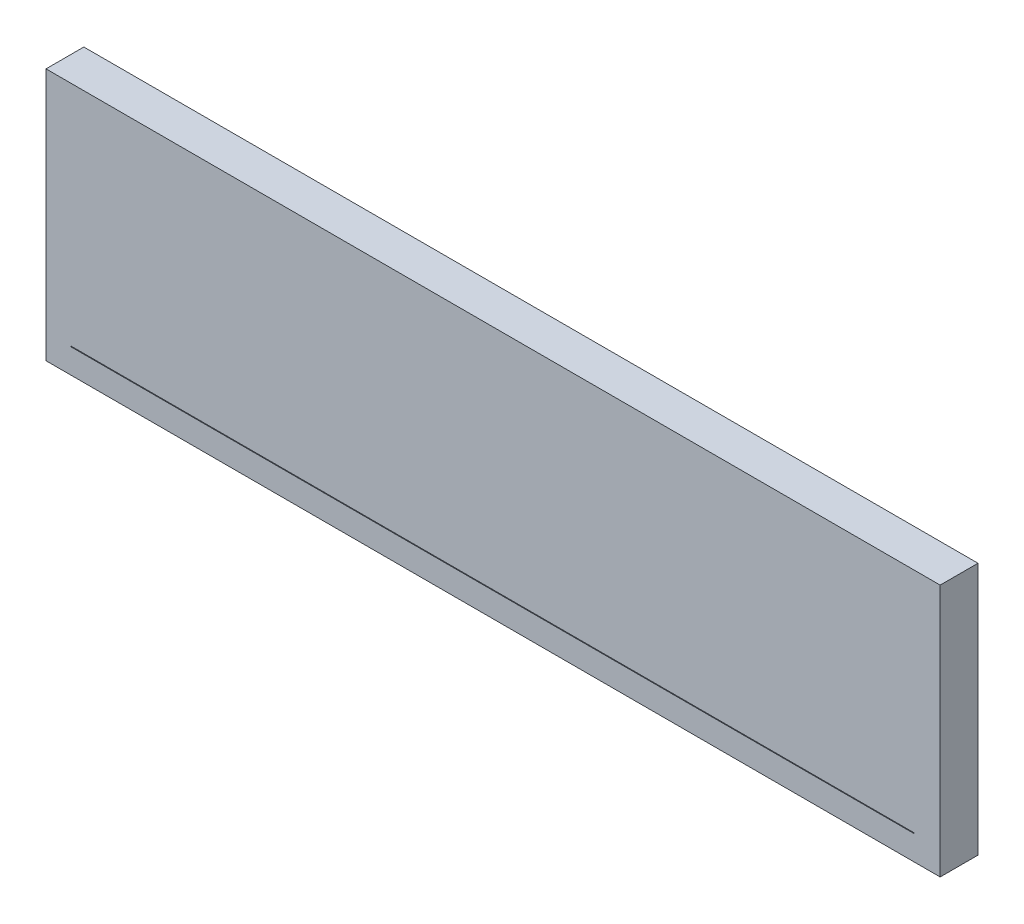
ISO-10303-21;
HEADER;
FILE_DESCRIPTION(('STEP AP214'),'2;1');
FILE_NAME('part.step','',(''),(''),'','','');
FILE_SCHEMA(('AUTOMOTIVE_DESIGN { 1 0 10303 214 1 1 1 1 }'));
ENDSEC;
DATA;
#1=APPLICATION_CONTEXT('core data for automotive mechanical design processes');
#2=APPLICATION_PROTOCOL_DEFINITION('international standard','automotive_design',2000,#1);
#3=PRODUCT_CONTEXT('',#1,'mechanical');
#4=PRODUCT('Part','Part','',(#3));
#5=PRODUCT_RELATED_PRODUCT_CATEGORY('part','',(#4));
#6=PRODUCT_DEFINITION_FORMATION('','',#4);
#7=PRODUCT_DEFINITION_CONTEXT('part definition',#1,'design');
#8=PRODUCT_DEFINITION('design','',#6,#7);
#9=PRODUCT_DEFINITION_SHAPE('','',#8);
#10=(LENGTH_UNIT() NAMED_UNIT(*) SI_UNIT(.MILLI.,.METRE.));
#11=(NAMED_UNIT(*) PLANE_ANGLE_UNIT() SI_UNIT($,.RADIAN.));
#12=(NAMED_UNIT(*) SI_UNIT($,.STERADIAN.) SOLID_ANGLE_UNIT());
#13=UNCERTAINTY_MEASURE_WITH_UNIT(LENGTH_MEASURE(1.E-05),#10,'distance_accuracy_value','');
#14=(GEOMETRIC_REPRESENTATION_CONTEXT(3) GLOBAL_UNCERTAINTY_ASSIGNED_CONTEXT((#13)) GLOBAL_UNIT_ASSIGNED_CONTEXT((#10,
#11,#12)) REPRESENTATION_CONTEXT('',''));
#15=CARTESIAN_POINT('',(0.,0.,0.));
#16=DIRECTION('',(0.,0.,1.));
#17=DIRECTION('',(1.,0.,0.));
#18=AXIS2_PLACEMENT_3D('',#15,#16,#17);
#19=CARTESIAN_POINT('',(-16.7,-4.01,1.));
#20=DIRECTION('',(0.,1.,0.));
#21=DIRECTION('',(0.,0.,1.));
#22=AXIS2_PLACEMENT_3D('',#19,#20,#21);
#23=PLANE('',#22);
#24=DIRECTION('',(1.,0.,0.));
#25=VECTOR('',#24,1.);
#26=CARTESIAN_POINT('',(-16.7,-4.01,0.));
#27=LINE('',#26,#25);
#28=CARTESIAN_POINT('',(-16.7,-4.01,0.));
#29=VERTEX_POINT('',#28);
#30=CARTESIAN_POINT('',(16.7,-4.01,0.));
#31=VERTEX_POINT('',#30);
#32=EDGE_CURVE('E64',#29,#31,#27,.T.);
#33=ORIENTED_EDGE('',*,*,#32,.T.);
#34=DIRECTION('',(0.,0.,-1.));
#35=VECTOR('',#34,1.);
#36=CARTESIAN_POINT('',(16.7,-4.01,1.));
#37=LINE('',#36,#35);
#38=CARTESIAN_POINT('',(16.7,-4.01,1.));
#39=VERTEX_POINT('',#38);
#40=EDGE_CURVE('E43',#39,#31,#37,.T.);
#41=ORIENTED_EDGE('',*,*,#40,.F.);
#42=DIRECTION('',(1.,0.,0.));
#43=VECTOR('',#42,1.);
#44=CARTESIAN_POINT('',(-16.7,-4.01,1.));
#45=LINE('',#44,#43);
#46=CARTESIAN_POINT('',(-16.7,-4.01,1.));
#47=VERTEX_POINT('',#46);
#48=EDGE_CURVE('E51',#47,#39,#45,.T.);
#49=ORIENTED_EDGE('',*,*,#48,.F.);
#50=DIRECTION('',(0.,0.,-1.));
#51=VECTOR('',#50,1.);
#52=CARTESIAN_POINT('',(-16.7,-4.01,1.));
#53=LINE('',#52,#51);
#54=EDGE_CURVE('E11',#47,#29,#53,.T.);
#55=ORIENTED_EDGE('',*,*,#54,.T.);
#56=EDGE_LOOP('',(#33,#41,#49,#55));
#57=FACE_BOUND('',#56,.T.);
#58=ADVANCED_FACE('F35',(#57),#23,.F.);
#59=CARTESIAN_POINT('',(0.,0.,1.));
#60=DIRECTION('',(0.,0.,-1.));
#61=DIRECTION('',(-1.,0.,0.));
#62=AXIS2_PLACEMENT_3D('',#59,#60,#61);
#63=PLANE('',#62);
#64=DIRECTION('',(0.,-1.,0.));
#65=VECTOR('',#64,1.);
#66=CARTESIAN_POINT('',(-16.7,-4.03759629206268,1.));
#67=LINE('',#66,#65);
#68=CARTESIAN_POINT('',(-16.7,-4.03759629206268,1.));
#69=VERTEX_POINT('',#68);
#70=EDGE_CURVE('E141',#47,#69,#67,.T.);
#71=ORIENTED_EDGE('',*,*,#70,.F.);
#72=ORIENTED_EDGE('',*,*,#48,.T.);
#73=DIRECTION('',(0.,1.,0.));
#74=VECTOR('',#73,1.);
#75=CARTESIAN_POINT('',(16.7,4.01,1.));
#76=LINE('',#75,#74);
#77=CARTESIAN_POINT('',(16.7,-4.03759629206268,1.));
#78=VERTEX_POINT('',#77);
#79=EDGE_CURVE('E85',#78,#39,#76,.T.);
#80=ORIENTED_EDGE('',*,*,#79,.F.);
#81=DIRECTION('',(1.,0.,0.));
#82=VECTOR('',#81,1.);
#83=CARTESIAN_POINT('',(16.7,-4.03759629206268,1.));
#84=LINE('',#83,#82);
#85=EDGE_CURVE('E138',#69,#78,#84,.T.);
#86=ORIENTED_EDGE('',*,*,#85,.F.);
#87=EDGE_LOOP('',(#71,#72,#80,#86));
#88=FACE_BOUND('',#87,.T.);
#89=DIRECTION('',(0.,1.,0.));
#90=VECTOR('',#89,1.);
#91=CARTESIAN_POINT('',(17.7434463761585,4.01,1.));
#92=LINE('',#91,#90);
#93=CARTESIAN_POINT('',(17.7434463761585,-5.011,1.));
#94=VERTEX_POINT('',#93);
#95=CARTESIAN_POINT('',(17.7434463761585,5.01,1.));
#96=VERTEX_POINT('',#95);
#97=EDGE_CURVE('E102',#94,#96,#92,.T.);
#98=ORIENTED_EDGE('',*,*,#97,.T.);
#99=DIRECTION('',(-1.,0.,0.));
#100=VECTOR('',#99,1.);
#101=CARTESIAN_POINT('',(-17.7,5.01,1.));
#102=LINE('',#101,#100);
#103=CARTESIAN_POINT('',(-17.7,5.01,1.));
#104=VERTEX_POINT('',#103);
#105=EDGE_CURVE('E112',#96,#104,#102,.T.);
#106=ORIENTED_EDGE('',*,*,#105,.T.);
#107=DIRECTION('',(0.,-1.,0.));
#108=VECTOR('',#107,1.);
#109=CARTESIAN_POINT('',(-17.7,-5.01100000000001,1.));
#110=LINE('',#109,#108);
#111=CARTESIAN_POINT('',(-17.7,-5.01100000000001,1.));
#112=VERTEX_POINT('',#111);
#113=EDGE_CURVE('E109',#104,#112,#110,.T.);
#114=ORIENTED_EDGE('',*,*,#113,.T.);
#115=DIRECTION('',(1.,0.,0.));
#116=VECTOR('',#115,1.);
#117=CARTESIAN_POINT('',(17.7434463761585,-5.011,1.));
#118=LINE('',#117,#116);
#119=EDGE_CURVE('E106',#112,#94,#118,.T.);
#120=ORIENTED_EDGE('',*,*,#119,.T.);
#121=EDGE_LOOP('',(#98,#106,#114,#120));
#122=FACE_BOUND('',#121,.T.);
#123=ADVANCED_FACE('F201',(#88,#122),#63,.F.);
#124=CARTESIAN_POINT('',(0.,0.,0.));
#125=DIRECTION('',(0.,0.,-1.));
#126=DIRECTION('',(-1.,0.,0.));
#127=AXIS2_PLACEMENT_3D('',#124,#125,#126);
#128=PLANE('',#127);
#129=DIRECTION('',(0.,1.,0.));
#130=VECTOR('',#129,1.);
#131=CARTESIAN_POINT('',(16.7,-4.01,0.));
#132=LINE('',#131,#130);
#133=CARTESIAN_POINT('',(16.7,4.01,0.));
#134=VERTEX_POINT('',#133);
#135=EDGE_CURVE('E74',#31,#134,#132,.T.);
#136=ORIENTED_EDGE('',*,*,#135,.F.);
#137=ORIENTED_EDGE('',*,*,#32,.F.);
#138=DIRECTION('',(0.,-1.,0.));
#139=VECTOR('',#138,1.);
#140=CARTESIAN_POINT('',(-16.7,-4.01,0.));
#141=LINE('',#140,#139);
#142=CARTESIAN_POINT('',(-16.7,4.01,0.));
#143=VERTEX_POINT('',#142);
#144=EDGE_CURVE('E70',#143,#29,#141,.T.);
#145=ORIENTED_EDGE('',*,*,#144,.F.);
#146=DIRECTION('',(-1.,0.,0.));
#147=VECTOR('',#146,1.);
#148=CARTESIAN_POINT('',(-16.7,4.01,0.));
#149=LINE('',#148,#147);
#150=EDGE_CURVE('E77',#134,#143,#149,.T.);
#151=ORIENTED_EDGE('',*,*,#150,.F.);
#152=EDGE_LOOP('',(#136,#137,#145,#151));
#153=FACE_BOUND('',#152,.T.);
#154=ADVANCED_FACE('F75',(#153),#128,.T.);
#155=CARTESIAN_POINT('',(-16.7,-4.03759629206268,-0.5));
#156=DIRECTION('',(-1.,0.,0.));
#157=DIRECTION('',(0.,0.,1.));
#158=AXIS2_PLACEMENT_3D('',#155,#156,#157);
#159=PLANE('',#158);
#160=ORIENTED_EDGE('',*,*,#144,.T.);
#161=ORIENTED_EDGE('',*,*,#54,.F.);
#162=ORIENTED_EDGE('',*,*,#70,.T.);
#163=DIRECTION('',(0.,0.,1.));
#164=VECTOR('',#163,1.);
#165=CARTESIAN_POINT('',(-16.7,-4.03759629206268,-0.5));
#166=LINE('',#165,#164);
#167=CARTESIAN_POINT('',(-16.7,-4.03759629206268,-0.5));
#168=VERTEX_POINT('',#167);
#169=EDGE_CURVE('E126',#168,#69,#166,.T.);
#170=ORIENTED_EDGE('',*,*,#169,.F.);
#171=DIRECTION('',(0.,-1.,0.));
#172=VECTOR('',#171,1.);
#173=CARTESIAN_POINT('',(-16.7,-4.03759629206268,-0.5));
#174=LINE('',#173,#172);
#175=CARTESIAN_POINT('',(-16.7,4.01,-0.5));
#176=VERTEX_POINT('',#175);
#177=EDGE_CURVE('E137',#176,#168,#174,.T.);
#178=ORIENTED_EDGE('',*,*,#177,.F.);
#179=DIRECTION('',(0.,0.,1.));
#180=VECTOR('',#179,1.);
#181=CARTESIAN_POINT('',(-16.7,4.01,-0.5));
#182=LINE('',#181,#180);
#183=EDGE_CURVE('E115',#176,#143,#182,.T.);
#184=ORIENTED_EDGE('',*,*,#183,.T.);
#185=EDGE_LOOP('',(#160,#161,#162,#170,#178,#184));
#186=FACE_BOUND('',#185,.T.);
#187=ADVANCED_FACE('F167',(#186),#159,.F.);
#188=CARTESIAN_POINT('',(16.7,4.01,-0.5));
#189=DIRECTION('',(1.,0.,0.));
#190=DIRECTION('',(0.,0.,-1.));
#191=AXIS2_PLACEMENT_3D('',#188,#189,#190);
#192=PLANE('',#191);
#193=ORIENTED_EDGE('',*,*,#79,.T.);
#194=ORIENTED_EDGE('',*,*,#40,.T.);
#195=ORIENTED_EDGE('',*,*,#135,.T.);
#196=DIRECTION('',(0.,0.,1.));
#197=VECTOR('',#196,1.);
#198=CARTESIAN_POINT('',(16.7,4.01,-0.5));
#199=LINE('',#198,#197);
#200=CARTESIAN_POINT('',(16.7,4.01,-0.5));
#201=VERTEX_POINT('',#200);
#202=EDGE_CURVE('E132',#201,#134,#199,.T.);
#203=ORIENTED_EDGE('',*,*,#202,.F.);
#204=DIRECTION('',(0.,1.,0.));
#205=VECTOR('',#204,1.);
#206=CARTESIAN_POINT('',(16.7,4.01,-0.5));
#207=LINE('',#206,#205);
#208=CARTESIAN_POINT('',(16.7,-4.03759629206268,-0.5));
#209=VERTEX_POINT('',#208);
#210=EDGE_CURVE('E146',#209,#201,#207,.T.);
#211=ORIENTED_EDGE('',*,*,#210,.F.);
#212=DIRECTION('',(0.,0.,1.));
#213=VECTOR('',#212,1.);
#214=CARTESIAN_POINT('',(16.7,-4.03759629206268,-0.5));
#215=LINE('',#214,#213);
#216=EDGE_CURVE('E129',#209,#78,#215,.T.);
#217=ORIENTED_EDGE('',*,*,#216,.T.);
#218=EDGE_LOOP('',(#193,#194,#195,#203,#211,#217));
#219=FACE_BOUND('',#218,.T.);
#220=ADVANCED_FACE('F83',(#219),#192,.F.);
#221=CARTESIAN_POINT('',(17.7434463761585,4.01,-0.5));
#222=DIRECTION('',(1.,0.,0.));
#223=DIRECTION('',(0.,0.,-1.));
#224=AXIS2_PLACEMENT_3D('',#221,#222,#223);
#225=PLANE('',#224);
#226=ORIENTED_EDGE('',*,*,#97,.F.);
#227=DIRECTION('',(0.,0.,1.));
#228=VECTOR('',#227,1.);
#229=CARTESIAN_POINT('',(17.7434463761585,-5.011,-0.5));
#230=LINE('',#229,#228);
#231=CARTESIAN_POINT('',(17.7434463761585,-5.011,-0.5));
#232=VERTEX_POINT('',#231);
#233=EDGE_CURVE('E81',#232,#94,#230,.T.);
#234=ORIENTED_EDGE('',*,*,#233,.F.);
#235=DIRECTION('',(0.,1.,0.));
#236=VECTOR('',#235,1.);
#237=CARTESIAN_POINT('',(17.7434463761585,4.01,-0.5));
#238=LINE('',#237,#236);
#239=CARTESIAN_POINT('',(17.7434463761585,5.01,-0.5));
#240=VERTEX_POINT('',#239);
#241=EDGE_CURVE('E105',#232,#240,#238,.T.);
#242=ORIENTED_EDGE('',*,*,#241,.T.);
#243=DIRECTION('',(0.,0.,1.));
#244=VECTOR('',#243,1.);
#245=CARTESIAN_POINT('',(17.7434463761585,5.01,-0.5));
#246=LINE('',#245,#244);
#247=EDGE_CURVE('E90',#240,#96,#246,.T.);
#248=ORIENTED_EDGE('',*,*,#247,.T.);
#249=EDGE_LOOP('',(#226,#234,#242,#248));
#250=FACE_BOUND('',#249,.T.);
#251=ADVANCED_FACE('F208',(#250),#225,.T.);
#252=CARTESIAN_POINT('',(17.7434463761585,-5.011,-0.5));
#253=DIRECTION('',(0.,-1.,0.));
#254=DIRECTION('',(0.,0.,-1.));
#255=AXIS2_PLACEMENT_3D('',#252,#253,#254);
#256=PLANE('',#255);
#257=ORIENTED_EDGE('',*,*,#119,.F.);
#258=DIRECTION('',(0.,0.,1.));
#259=VECTOR('',#258,1.);
#260=CARTESIAN_POINT('',(-17.7,-5.01100000000001,-0.5));
#261=LINE('',#260,#259);
#262=CARTESIAN_POINT('',(-17.7,-5.01100000000001,-0.5));
#263=VERTEX_POINT('',#262);
#264=EDGE_CURVE('E97',#263,#112,#261,.T.);
#265=ORIENTED_EDGE('',*,*,#264,.F.);
#266=DIRECTION('',(1.,0.,0.));
#267=VECTOR('',#266,1.);
#268=CARTESIAN_POINT('',(16.7,-5.011,-0.5));
#269=LINE('',#268,#267);
#270=EDGE_CURVE('E94',#263,#232,#269,.T.);
#271=ORIENTED_EDGE('',*,*,#270,.T.);
#272=ORIENTED_EDGE('',*,*,#233,.T.);
#273=EDGE_LOOP('',(#257,#265,#271,#272));
#274=FACE_BOUND('',#273,.T.);
#275=ADVANCED_FACE('F220',(#274),#256,.T.);
#276=CARTESIAN_POINT('',(-17.7,-5.01100000000001,-0.5));
#277=DIRECTION('',(-1.,0.,0.));
#278=DIRECTION('',(0.,0.,1.));
#279=AXIS2_PLACEMENT_3D('',#276,#277,#278);
#280=PLANE('',#279);
#281=ORIENTED_EDGE('',*,*,#113,.F.);
#282=DIRECTION('',(0.,0.,1.));
#283=VECTOR('',#282,1.);
#284=CARTESIAN_POINT('',(-17.7,5.01,-0.5));
#285=LINE('',#284,#283);
#286=CARTESIAN_POINT('',(-17.7,5.01,-0.5));
#287=VERTEX_POINT('',#286);
#288=EDGE_CURVE('E93',#287,#104,#285,.T.);
#289=ORIENTED_EDGE('',*,*,#288,.F.);
#290=DIRECTION('',(0.,-1.,0.));
#291=VECTOR('',#290,1.);
#292=CARTESIAN_POINT('',(-17.7,-4.03759629206268,-0.5));
#293=LINE('',#292,#291);
#294=EDGE_CURVE('E118',#287,#263,#293,.T.);
#295=ORIENTED_EDGE('',*,*,#294,.T.);
#296=ORIENTED_EDGE('',*,*,#264,.T.);
#297=EDGE_LOOP('',(#281,#289,#295,#296));
#298=FACE_BOUND('',#297,.T.);
#299=ADVANCED_FACE('F218',(#298),#280,.T.);
#300=CARTESIAN_POINT('',(-17.7,5.01,-0.5));
#301=DIRECTION('',(0.,1.,0.));
#302=DIRECTION('',(0.,0.,1.));
#303=AXIS2_PLACEMENT_3D('',#300,#301,#302);
#304=PLANE('',#303);
#305=ORIENTED_EDGE('',*,*,#105,.F.);
#306=ORIENTED_EDGE('',*,*,#247,.F.);
#307=DIRECTION('',(-1.,0.,0.));
#308=VECTOR('',#307,1.);
#309=CARTESIAN_POINT('',(-16.7,5.01,-0.5));
#310=LINE('',#309,#308);
#311=EDGE_CURVE('E121',#240,#287,#310,.T.);
#312=ORIENTED_EDGE('',*,*,#311,.T.);
#313=ORIENTED_EDGE('',*,*,#288,.T.);
#314=EDGE_LOOP('',(#305,#306,#312,#313));
#315=FACE_BOUND('',#314,.T.);
#316=ADVANCED_FACE('F212',(#315),#304,.T.);
#317=CARTESIAN_POINT('',(0.,0.,-0.5));
#318=DIRECTION('',(0.,0.,-1.));
#319=DIRECTION('',(-1.,0.,0.));
#320=AXIS2_PLACEMENT_3D('',#317,#318,#319);
#321=PLANE('',#320);
#322=ORIENTED_EDGE('',*,*,#177,.T.);
#323=DIRECTION('',(1.,0.,0.));
#324=VECTOR('',#323,1.);
#325=CARTESIAN_POINT('',(16.7,-4.03759629206268,-0.5));
#326=LINE('',#325,#324);
#327=EDGE_CURVE('E149',#168,#209,#326,.T.);
#328=ORIENTED_EDGE('',*,*,#327,.T.);
#329=ORIENTED_EDGE('',*,*,#210,.T.);
#330=DIRECTION('',(-1.,0.,0.));
#331=VECTOR('',#330,1.);
#332=CARTESIAN_POINT('',(-16.7,4.01,-0.5));
#333=LINE('',#332,#331);
#334=EDGE_CURVE('E130',#201,#176,#333,.T.);
#335=ORIENTED_EDGE('',*,*,#334,.T.);
#336=EDGE_LOOP('',(#322,#328,#329,#335));
#337=FACE_BOUND('',#336,.T.);
#338=ORIENTED_EDGE('',*,*,#241,.F.);
#339=ORIENTED_EDGE('',*,*,#270,.F.);
#340=ORIENTED_EDGE('',*,*,#294,.F.);
#341=ORIENTED_EDGE('',*,*,#311,.F.);
#342=EDGE_LOOP('',(#338,#339,#340,#341));
#343=FACE_BOUND('',#342,.T.);
#344=ADVANCED_FACE('F156',(#337,#343),#321,.T.);
#345=CARTESIAN_POINT('',(-16.7,4.01,-0.5));
#346=DIRECTION('',(0.,1.,0.));
#347=DIRECTION('',(0.,0.,1.));
#348=AXIS2_PLACEMENT_3D('',#345,#346,#347);
#349=PLANE('',#348);
#350=ORIENTED_EDGE('',*,*,#150,.T.);
#351=ORIENTED_EDGE('',*,*,#183,.F.);
#352=ORIENTED_EDGE('',*,*,#334,.F.);
#353=ORIENTED_EDGE('',*,*,#202,.T.);
#354=EDGE_LOOP('',(#350,#351,#352,#353));
#355=FACE_BOUND('',#354,.T.);
#356=ADVANCED_FACE('F288',(#355),#349,.F.);
#357=CARTESIAN_POINT('',(16.7,-4.03759629206268,-0.5));
#358=DIRECTION('',(0.,-1.,0.));
#359=DIRECTION('',(0.,0.,-1.));
#360=AXIS2_PLACEMENT_3D('',#357,#358,#359);
#361=PLANE('',#360);
#362=ORIENTED_EDGE('',*,*,#85,.T.);
#363=ORIENTED_EDGE('',*,*,#216,.F.);
#364=ORIENTED_EDGE('',*,*,#327,.F.);
#365=ORIENTED_EDGE('',*,*,#169,.T.);
#366=EDGE_LOOP('',(#362,#363,#364,#365));
#367=FACE_BOUND('',#366,.T.);
#368=ADVANCED_FACE('F199',(#367),#361,.F.);
#369=CLOSED_SHELL('',(#58,#123,#154,#187,#220,#251,#275,#299,#316,#344,#356,#368));
#370=MANIFOLD_SOLID_BREP('B2',#369);
#371=ADVANCED_BREP_SHAPE_REPRESENTATION('',(#18,#370),#14);
#372=SHAPE_DEFINITION_REPRESENTATION(#9,#371);
ENDSEC;
END-ISO-10303-21;
